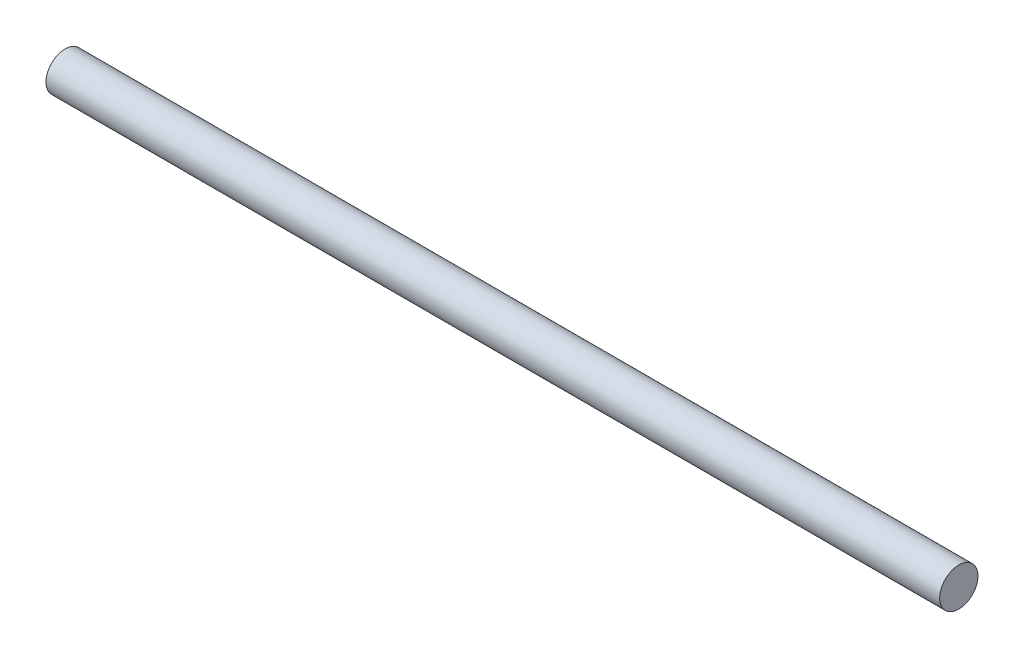
ISO-10303-21;
HEADER;
FILE_DESCRIPTION(('STEP AP214'),'2;1');
FILE_NAME('part.step','',(''),(''),'','','');
FILE_SCHEMA(('AUTOMOTIVE_DESIGN { 1 0 10303 214 1 1 1 1 }'));
ENDSEC;
DATA;
#1=APPLICATION_CONTEXT('core data for automotive mechanical design processes');
#2=APPLICATION_PROTOCOL_DEFINITION('international standard','automotive_design',2000,#1);
#3=PRODUCT_CONTEXT('',#1,'mechanical');
#4=PRODUCT('Part','Part','',(#3));
#5=PRODUCT_RELATED_PRODUCT_CATEGORY('part','',(#4));
#6=PRODUCT_DEFINITION_FORMATION('','',#4);
#7=PRODUCT_DEFINITION_CONTEXT('part definition',#1,'design');
#8=PRODUCT_DEFINITION('design','',#6,#7);
#9=PRODUCT_DEFINITION_SHAPE('','',#8);
#10=(LENGTH_UNIT() NAMED_UNIT(*) SI_UNIT(.MILLI.,.METRE.));
#11=(NAMED_UNIT(*) PLANE_ANGLE_UNIT() SI_UNIT($,.RADIAN.));
#12=(NAMED_UNIT(*) SI_UNIT($,.STERADIAN.) SOLID_ANGLE_UNIT());
#13=UNCERTAINTY_MEASURE_WITH_UNIT(LENGTH_MEASURE(1.E-05),#10,'distance_accuracy_value','');
#14=(GEOMETRIC_REPRESENTATION_CONTEXT(3) GLOBAL_UNCERTAINTY_ASSIGNED_CONTEXT((#13)) GLOBAL_UNIT_ASSIGNED_CONTEXT((#10,
#11,#12)) REPRESENTATION_CONTEXT('',''));
#15=CARTESIAN_POINT('',(0.,0.,0.));
#16=DIRECTION('',(0.,0.,1.));
#17=DIRECTION('',(1.,0.,0.));
#18=AXIS2_PLACEMENT_3D('',#15,#16,#17);
#19=CARTESIAN_POINT('',(35.,0.,0.));
#20=DIRECTION('',(-1.,0.,0.));
#21=DIRECTION('',(0.,0.,1.));
#22=AXIS2_PLACEMENT_3D('',#19,#20,#21);
#23=CYLINDRICAL_SURFACE('',#22,1.5);
#24=CARTESIAN_POINT('',(35.,0.,0.));
#25=DIRECTION('',(1.,0.,0.));
#26=DIRECTION('',(0.,0.,-1.));
#27=AXIS2_PLACEMENT_3D('',#24,#25,#26);
#28=CIRCLE('',#27,1.5);
#29=CARTESIAN_POINT('',(35.,0.,-1.5));
#30=VERTEX_POINT('',#29);
#31=EDGE_CURVE('E10',#30,#30,#28,.T.);
#32=ORIENTED_EDGE('',*,*,#31,.F.);
#33=EDGE_LOOP('',(#32));
#34=FACE_BOUND('',#33,.T.);
#35=CARTESIAN_POINT('',(-35.,0.,0.));
#36=DIRECTION('',(1.,0.,0.));
#37=DIRECTION('',(0.,0.,-1.));
#38=AXIS2_PLACEMENT_3D('',#35,#36,#37);
#39=CIRCLE('',#38,1.5);
#40=CARTESIAN_POINT('',(-35.,0.,-1.5));
#41=VERTEX_POINT('',#40);
#42=EDGE_CURVE('E40',#41,#41,#39,.T.);
#43=ORIENTED_EDGE('',*,*,#42,.T.);
#44=EDGE_LOOP('',(#43));
#45=FACE_BOUND('',#44,.T.);
#46=ADVANCED_FACE('F37',(#34,#45),#23,.T.);
#47=CARTESIAN_POINT('',(35.,0.,0.));
#48=DIRECTION('',(1.,0.,0.));
#49=DIRECTION('',(0.,0.,-1.));
#50=AXIS2_PLACEMENT_3D('',#47,#48,#49);
#51=PLANE('',#50);
#52=ORIENTED_EDGE('',*,*,#31,.T.);
#53=EDGE_LOOP('',(#52));
#54=FACE_BOUND('',#53,.T.);
#55=ADVANCED_FACE('F54',(#54),#51,.T.);
#56=CARTESIAN_POINT('',(-35.,0.,0.));
#57=DIRECTION('',(1.,0.,0.));
#58=DIRECTION('',(0.,0.,-1.));
#59=AXIS2_PLACEMENT_3D('',#56,#57,#58);
#60=PLANE('',#59);
#61=ORIENTED_EDGE('',*,*,#42,.F.);
#62=EDGE_LOOP('',(#61));
#63=FACE_BOUND('',#62,.T.);
#64=ADVANCED_FACE('F52',(#63),#60,.F.);
#65=CLOSED_SHELL('',(#46,#55,#64));
#66=MANIFOLD_SOLID_BREP('B2',#65);
#67=ADVANCED_BREP_SHAPE_REPRESENTATION('',(#18,#66),#14);
#68=SHAPE_DEFINITION_REPRESENTATION(#9,#67);
ENDSEC;
END-ISO-10303-21;
